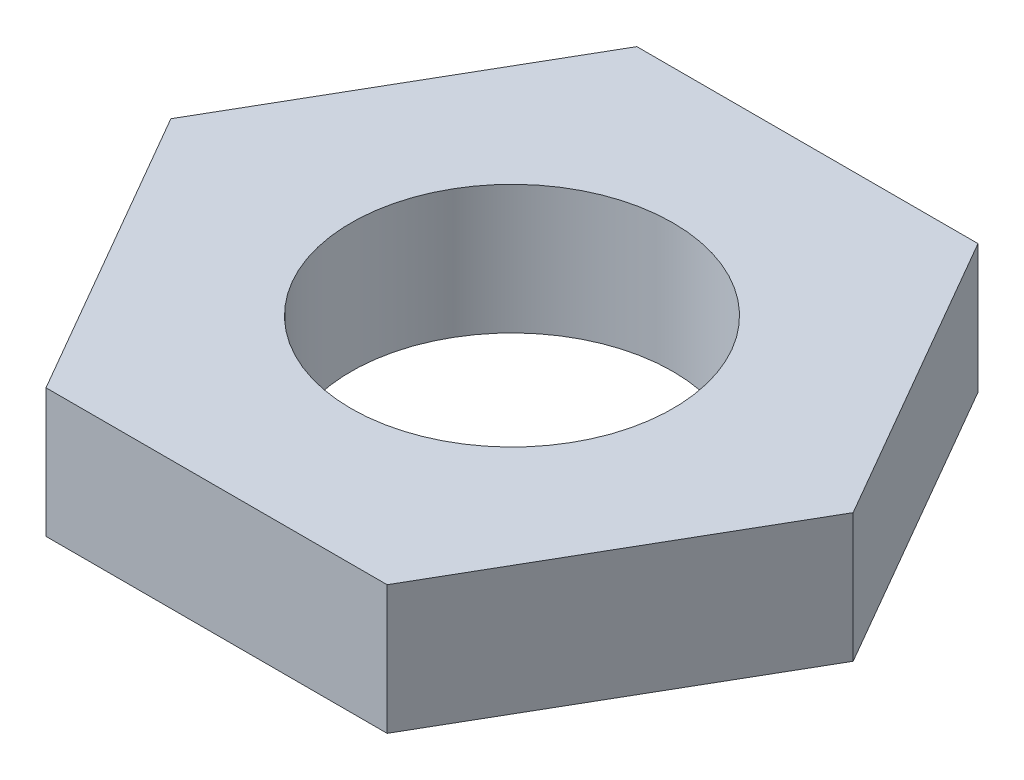
ISO-10303-21;
HEADER;
FILE_DESCRIPTION(('STEP AP214'),'2;1');
FILE_NAME('part.step','',(''),(''),'','','');
FILE_SCHEMA(('AUTOMOTIVE_DESIGN { 1 0 10303 214 1 1 1 1 }'));
ENDSEC;
DATA;
#1=APPLICATION_CONTEXT('core data for automotive mechanical design processes');
#2=APPLICATION_PROTOCOL_DEFINITION('international standard','automotive_design',2000,#1);
#3=PRODUCT_CONTEXT('',#1,'mechanical');
#4=PRODUCT('Part','Part','',(#3));
#5=PRODUCT_RELATED_PRODUCT_CATEGORY('part','',(#4));
#6=PRODUCT_DEFINITION_FORMATION('','',#4);
#7=PRODUCT_DEFINITION_CONTEXT('part definition',#1,'design');
#8=PRODUCT_DEFINITION('design','',#6,#7);
#9=PRODUCT_DEFINITION_SHAPE('','',#8);
#10=(LENGTH_UNIT() NAMED_UNIT(*) SI_UNIT(.MILLI.,.METRE.));
#11=(NAMED_UNIT(*) PLANE_ANGLE_UNIT() SI_UNIT($,.RADIAN.));
#12=(NAMED_UNIT(*) SI_UNIT($,.STERADIAN.) SOLID_ANGLE_UNIT());
#13=UNCERTAINTY_MEASURE_WITH_UNIT(LENGTH_MEASURE(1.E-05),#10,'distance_accuracy_value','');
#14=(GEOMETRIC_REPRESENTATION_CONTEXT(3) GLOBAL_UNCERTAINTY_ASSIGNED_CONTEXT((#13)) GLOBAL_UNIT_ASSIGNED_CONTEXT((#10,
#11,#12)) REPRESENTATION_CONTEXT('',''));
#15=CARTESIAN_POINT('',(0.,0.,0.));
#16=DIRECTION('',(0.,0.,1.));
#17=DIRECTION('',(1.,0.,0.));
#18=AXIS2_PLACEMENT_3D('',#15,#16,#17);
#19=CARTESIAN_POINT('',(-1.325,1.,2.29496732002876));
#20=DIRECTION('',(0.,0.,-1.));
#21=DIRECTION('',(-1.,0.,0.));
#22=AXIS2_PLACEMENT_3D('',#19,#20,#21);
#23=PLANE('',#22);
#24=DIRECTION('',(1.,0.,0.));
#25=VECTOR('',#24,1.);
#26=CARTESIAN_POINT('',(-1.325,0.,2.29496732002876));
#27=LINE('',#26,#25);
#28=CARTESIAN_POINT('',(-1.325,0.,2.29496732002876));
#29=VERTEX_POINT('',#28);
#30=CARTESIAN_POINT('',(1.325,0.,2.29496732002876));
#31=VERTEX_POINT('',#30);
#32=EDGE_CURVE('E122',#29,#31,#27,.T.);
#33=ORIENTED_EDGE('',*,*,#32,.T.);
#34=DIRECTION('',(0.,-1.,0.));
#35=VECTOR('',#34,1.);
#36=CARTESIAN_POINT('',(1.325,1.,2.29496732002876));
#37=LINE('',#36,#35);
#38=CARTESIAN_POINT('',(1.325,1.,2.29496732002876));
#39=VERTEX_POINT('',#38);
#40=EDGE_CURVE('E11',#39,#31,#37,.T.);
#41=ORIENTED_EDGE('',*,*,#40,.F.);
#42=DIRECTION('',(1.,0.,0.));
#43=VECTOR('',#42,1.);
#44=CARTESIAN_POINT('',(-1.325,1.,2.29496732002876));
#45=LINE('',#44,#43);
#46=CARTESIAN_POINT('',(-1.325,1.,2.29496732002876));
#47=VERTEX_POINT('',#46);
#48=EDGE_CURVE('E132',#47,#39,#45,.T.);
#49=ORIENTED_EDGE('',*,*,#48,.F.);
#50=DIRECTION('',(0.,-1.,0.));
#51=VECTOR('',#50,1.);
#52=CARTESIAN_POINT('',(-1.325,1.,2.29496732002876));
#53=LINE('',#52,#51);
#54=EDGE_CURVE('E118',#47,#29,#53,.T.);
#55=ORIENTED_EDGE('',*,*,#54,.T.);
#56=EDGE_LOOP('',(#33,#41,#49,#55));
#57=FACE_BOUND('',#56,.T.);
#58=ADVANCED_FACE('F37',(#57),#23,.F.);
#59=CARTESIAN_POINT('',(1.325,1.,2.29496732002876));
#60=DIRECTION('',(-0.866025403784439,0.,-0.5));
#61=DIRECTION('',(-0.5,0.,0.866025403784439));
#62=AXIS2_PLACEMENT_3D('',#59,#60,#61);
#63=PLANE('',#62);
#64=DIRECTION('',(0.5,0.,-0.866025403784439));
#65=VECTOR('',#64,1.);
#66=CARTESIAN_POINT('',(1.325,0.,2.29496732002876));
#67=LINE('',#66,#65);
#68=CARTESIAN_POINT('',(2.65,0.,0.));
#69=VERTEX_POINT('',#68);
#70=EDGE_CURVE('E125',#31,#69,#67,.T.);
#71=ORIENTED_EDGE('',*,*,#70,.T.);
#72=DIRECTION('',(0.,-1.,0.));
#73=VECTOR('',#72,1.);
#74=CARTESIAN_POINT('',(2.65,1.,0.));
#75=LINE('',#74,#73);
#76=CARTESIAN_POINT('',(2.65,1.,0.));
#77=VERTEX_POINT('',#76);
#78=EDGE_CURVE('E46',#77,#69,#75,.T.);
#79=ORIENTED_EDGE('',*,*,#78,.F.);
#80=DIRECTION('',(0.5,0.,-0.866025403784439));
#81=VECTOR('',#80,1.);
#82=CARTESIAN_POINT('',(1.325,1.,2.29496732002876));
#83=LINE('',#82,#81);
#84=EDGE_CURVE('E91',#39,#77,#83,.T.);
#85=ORIENTED_EDGE('',*,*,#84,.F.);
#86=ORIENTED_EDGE('',*,*,#40,.T.);
#87=EDGE_LOOP('',(#71,#79,#85,#86));
#88=FACE_BOUND('',#87,.T.);
#89=ADVANCED_FACE('F158',(#88),#63,.F.);
#90=CARTESIAN_POINT('',(2.65,1.,0.));
#91=DIRECTION('',(-0.866025403784439,0.,0.5));
#92=DIRECTION('',(0.5,0.,0.866025403784439));
#93=AXIS2_PLACEMENT_3D('',#90,#91,#92);
#94=PLANE('',#93);
#95=DIRECTION('',(-0.5,0.,-0.866025403784439));
#96=VECTOR('',#95,1.);
#97=CARTESIAN_POINT('',(2.65,0.,0.));
#98=LINE('',#97,#96);
#99=CARTESIAN_POINT('',(1.325,0.,-2.29496732002876));
#100=VERTEX_POINT('',#99);
#101=EDGE_CURVE('E127',#69,#100,#98,.T.);
#102=ORIENTED_EDGE('',*,*,#101,.T.);
#103=DIRECTION('',(0.,-1.,0.));
#104=VECTOR('',#103,1.);
#105=CARTESIAN_POINT('',(1.325,1.,-2.29496732002876));
#106=LINE('',#105,#104);
#107=CARTESIAN_POINT('',(1.325,1.,-2.29496732002876));
#108=VERTEX_POINT('',#107);
#109=EDGE_CURVE('E113',#108,#100,#106,.T.);
#110=ORIENTED_EDGE('',*,*,#109,.F.);
#111=DIRECTION('',(-0.5,0.,-0.866025403784439));
#112=VECTOR('',#111,1.);
#113=CARTESIAN_POINT('',(2.65,1.,0.));
#114=LINE('',#113,#112);
#115=EDGE_CURVE('E104',#77,#108,#114,.T.);
#116=ORIENTED_EDGE('',*,*,#115,.F.);
#117=ORIENTED_EDGE('',*,*,#78,.T.);
#118=EDGE_LOOP('',(#102,#110,#116,#117));
#119=FACE_BOUND('',#118,.T.);
#120=ADVANCED_FACE('F139',(#119),#94,.F.);
#121=CARTESIAN_POINT('',(1.325,1.,-2.29496732002876));
#122=DIRECTION('',(0.,0.,1.));
#123=DIRECTION('',(1.,0.,0.));
#124=AXIS2_PLACEMENT_3D('',#121,#122,#123);
#125=PLANE('',#124);
#126=DIRECTION('',(-1.,0.,0.));
#127=VECTOR('',#126,1.);
#128=CARTESIAN_POINT('',(1.325,0.,-2.29496732002876));
#129=LINE('',#128,#127);
#130=CARTESIAN_POINT('',(-1.325,0.,-2.29496732002876));
#131=VERTEX_POINT('',#130);
#132=EDGE_CURVE('E112',#100,#131,#129,.T.);
#133=ORIENTED_EDGE('',*,*,#132,.T.);
#134=DIRECTION('',(0.,-1.,0.));
#135=VECTOR('',#134,1.);
#136=CARTESIAN_POINT('',(-1.325,1.,-2.29496732002876));
#137=LINE('',#136,#135);
#138=CARTESIAN_POINT('',(-1.325,1.,-2.29496732002876));
#139=VERTEX_POINT('',#138);
#140=EDGE_CURVE('E109',#139,#131,#137,.T.);
#141=ORIENTED_EDGE('',*,*,#140,.F.);
#142=DIRECTION('',(-1.,0.,0.));
#143=VECTOR('',#142,1.);
#144=CARTESIAN_POINT('',(1.325,1.,-2.29496732002876));
#145=LINE('',#144,#143);
#146=EDGE_CURVE('E98',#108,#139,#145,.T.);
#147=ORIENTED_EDGE('',*,*,#146,.F.);
#148=ORIENTED_EDGE('',*,*,#109,.T.);
#149=EDGE_LOOP('',(#133,#141,#147,#148));
#150=FACE_BOUND('',#149,.T.);
#151=ADVANCED_FACE('F110',(#150),#125,.F.);
#152=CARTESIAN_POINT('',(-1.325,1.,-2.29496732002876));
#153=DIRECTION('',(0.866025403784439,0.,0.5));
#154=DIRECTION('',(0.5,0.,-0.866025403784439));
#155=AXIS2_PLACEMENT_3D('',#152,#153,#154);
#156=PLANE('',#155);
#157=DIRECTION('',(-0.5,0.,0.866025403784439));
#158=VECTOR('',#157,1.);
#159=CARTESIAN_POINT('',(-1.325,0.,-2.29496732002876));
#160=LINE('',#159,#158);
#161=CARTESIAN_POINT('',(-2.65,0.,0.));
#162=VERTEX_POINT('',#161);
#163=EDGE_CURVE('E77',#131,#162,#160,.T.);
#164=ORIENTED_EDGE('',*,*,#163,.T.);
#165=DIRECTION('',(0.,-1.,0.));
#166=VECTOR('',#165,1.);
#167=CARTESIAN_POINT('',(-2.65,1.,0.));
#168=LINE('',#167,#166);
#169=CARTESIAN_POINT('',(-2.65,1.,0.));
#170=VERTEX_POINT('',#169);
#171=EDGE_CURVE('E114',#170,#162,#168,.T.);
#172=ORIENTED_EDGE('',*,*,#171,.F.);
#173=DIRECTION('',(-0.5,0.,0.866025403784439));
#174=VECTOR('',#173,1.);
#175=CARTESIAN_POINT('',(-1.325,1.,-2.29496732002876));
#176=LINE('',#175,#174);
#177=EDGE_CURVE('E102',#139,#170,#176,.T.);
#178=ORIENTED_EDGE('',*,*,#177,.F.);
#179=ORIENTED_EDGE('',*,*,#140,.T.);
#180=EDGE_LOOP('',(#164,#172,#178,#179));
#181=FACE_BOUND('',#180,.T.);
#182=ADVANCED_FACE('F116',(#181),#156,.F.);
#183=CARTESIAN_POINT('',(-2.65,1.,0.));
#184=DIRECTION('',(0.866025403784439,0.,-0.5));
#185=DIRECTION('',(-0.5,0.,-0.866025403784439));
#186=AXIS2_PLACEMENT_3D('',#183,#184,#185);
#187=PLANE('',#186);
#188=DIRECTION('',(0.5,0.,0.866025403784439));
#189=VECTOR('',#188,1.);
#190=CARTESIAN_POINT('',(-2.65,0.,0.));
#191=LINE('',#190,#189);
#192=EDGE_CURVE('E83',#162,#29,#191,.T.);
#193=ORIENTED_EDGE('',*,*,#192,.T.);
#194=ORIENTED_EDGE('',*,*,#54,.F.);
#195=DIRECTION('',(0.5,0.,0.866025403784439));
#196=VECTOR('',#195,1.);
#197=CARTESIAN_POINT('',(-2.65,1.,0.));
#198=LINE('',#197,#196);
#199=EDGE_CURVE('E54',#170,#47,#198,.T.);
#200=ORIENTED_EDGE('',*,*,#199,.F.);
#201=ORIENTED_EDGE('',*,*,#171,.T.);
#202=EDGE_LOOP('',(#193,#194,#200,#201));
#203=FACE_BOUND('',#202,.T.);
#204=ADVANCED_FACE('F146',(#203),#187,.F.);
#205=CARTESIAN_POINT('',(0.,1.,0.));
#206=DIRECTION('',(0.,1.,0.));
#207=DIRECTION('',(0.,0.,1.));
#208=AXIS2_PLACEMENT_3D('',#205,#206,#207);
#209=PLANE('',#208);
#210=CARTESIAN_POINT('',(0.,1.,0.));
#211=DIRECTION('',(0.,1.,0.));
#212=DIRECTION('',(0.,0.,1.));
#213=AXIS2_PLACEMENT_3D('',#210,#211,#212);
#214=CIRCLE('',#213,1.25);
#215=CARTESIAN_POINT('',(0.,1.,1.25));
#216=VERTEX_POINT('',#215);
#217=EDGE_CURVE('E213',#216,#216,#214,.T.);
#218=ORIENTED_EDGE('',*,*,#217,.F.);
#219=EDGE_LOOP('',(#218));
#220=FACE_BOUND('',#219,.T.);
#221=ORIENTED_EDGE('',*,*,#48,.T.);
#222=ORIENTED_EDGE('',*,*,#84,.T.);
#223=ORIENTED_EDGE('',*,*,#115,.T.);
#224=ORIENTED_EDGE('',*,*,#146,.T.);
#225=ORIENTED_EDGE('',*,*,#177,.T.);
#226=ORIENTED_EDGE('',*,*,#199,.T.);
#227=EDGE_LOOP('',(#221,#222,#223,#224,#225,#226));
#228=FACE_BOUND('',#227,.T.);
#229=ADVANCED_FACE('F100',(#220,#228),#209,.T.);
#230=CARTESIAN_POINT('',(0.,0.,0.));
#231=DIRECTION('',(0.,1.,0.));
#232=DIRECTION('',(0.,0.,1.));
#233=AXIS2_PLACEMENT_3D('',#230,#231,#232);
#234=PLANE('',#233);
#235=CARTESIAN_POINT('',(0.,0.,0.));
#236=DIRECTION('',(0.,1.,0.));
#237=DIRECTION('',(0.,0.,1.));
#238=AXIS2_PLACEMENT_3D('',#235,#236,#237);
#239=CIRCLE('',#238,1.25);
#240=CARTESIAN_POINT('',(0.,0.,1.25));
#241=VERTEX_POINT('',#240);
#242=EDGE_CURVE('E40',#241,#241,#239,.T.);
#243=ORIENTED_EDGE('',*,*,#242,.T.);
#244=EDGE_LOOP('',(#243));
#245=FACE_BOUND('',#244,.T.);
#246=ORIENTED_EDGE('',*,*,#32,.F.);
#247=ORIENTED_EDGE('',*,*,#192,.F.);
#248=ORIENTED_EDGE('',*,*,#163,.F.);
#249=ORIENTED_EDGE('',*,*,#132,.F.);
#250=ORIENTED_EDGE('',*,*,#101,.F.);
#251=ORIENTED_EDGE('',*,*,#70,.F.);
#252=EDGE_LOOP('',(#246,#247,#248,#249,#250,#251));
#253=FACE_BOUND('',#252,.T.);
#254=ADVANCED_FACE('F142',(#245,#253),#234,.F.);
#255=CARTESIAN_POINT('',(0.,-4.,0.));
#256=DIRECTION('',(0.,1.,0.));
#257=DIRECTION('',(0.,0.,1.));
#258=AXIS2_PLACEMENT_3D('',#255,#256,#257);
#259=CYLINDRICAL_SURFACE('',#258,1.25);
#260=ORIENTED_EDGE('',*,*,#217,.T.);
#261=EDGE_LOOP('',(#260));
#262=FACE_BOUND('',#261,.T.);
#263=ORIENTED_EDGE('',*,*,#242,.F.);
#264=EDGE_LOOP('',(#263));
#265=FACE_BOUND('',#264,.T.);
#266=ADVANCED_FACE('F195',(#262,#265),#259,.F.);
#267=CLOSED_SHELL('',(#58,#89,#120,#151,#182,#204,#229,#254,#266));
#268=MANIFOLD_SOLID_BREP('B2',#267);
#269=ADVANCED_BREP_SHAPE_REPRESENTATION('',(#18,#268),#14);
#270=SHAPE_DEFINITION_REPRESENTATION(#9,#269);
ENDSEC;
END-ISO-10303-21;
